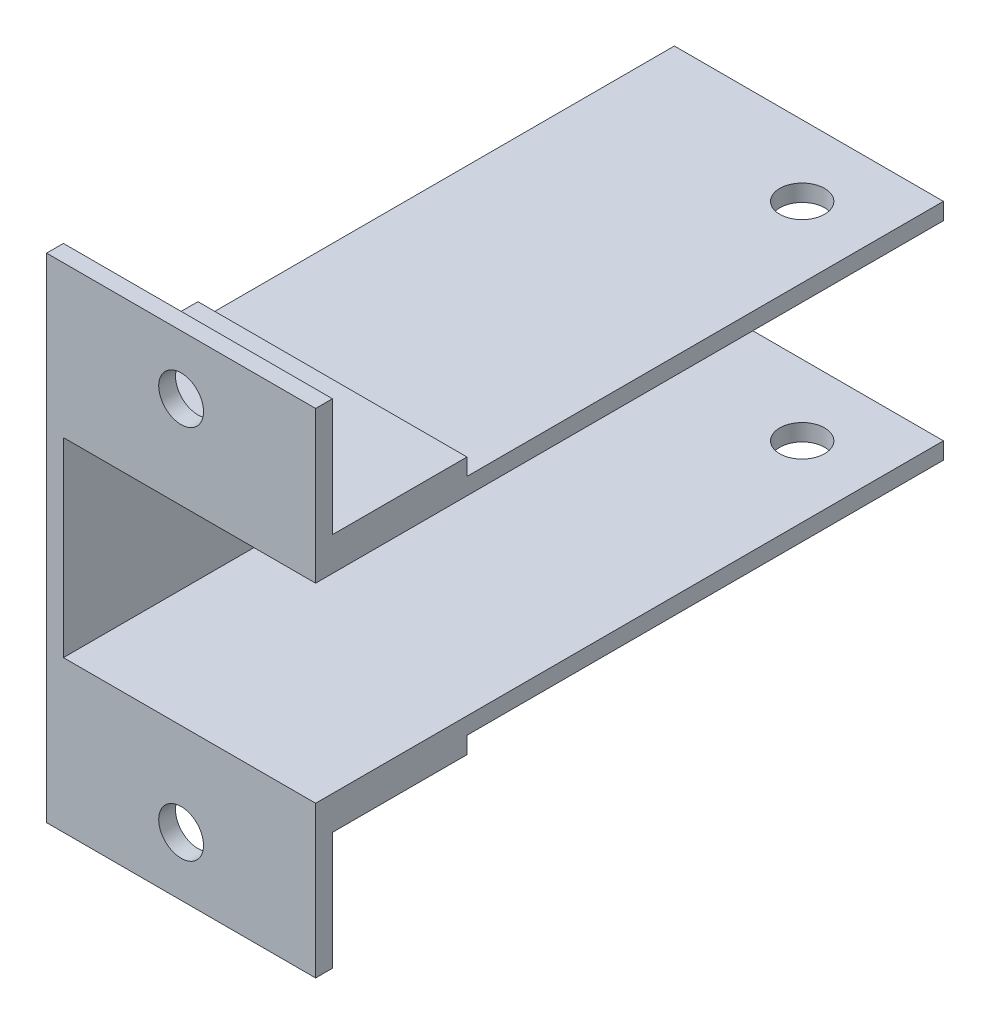
ISO-10303-21;
HEADER;
FILE_DESCRIPTION(('STEP AP214'),'2;1');
FILE_NAME('part.step','',(''),(''),'','','');
FILE_SCHEMA(('AUTOMOTIVE_DESIGN { 1 0 10303 214 1 1 1 1 }'));
ENDSEC;
DATA;
#1=APPLICATION_CONTEXT('core data for automotive mechanical design processes');
#2=APPLICATION_PROTOCOL_DEFINITION('international standard','automotive_design',2000,#1);
#3=PRODUCT_CONTEXT('',#1,'mechanical');
#4=PRODUCT('Part','Part','',(#3));
#5=PRODUCT_RELATED_PRODUCT_CATEGORY('part','',(#4));
#6=PRODUCT_DEFINITION_FORMATION('','',#4);
#7=PRODUCT_DEFINITION_CONTEXT('part definition',#1,'design');
#8=PRODUCT_DEFINITION('design','',#6,#7);
#9=PRODUCT_DEFINITION_SHAPE('','',#8);
#10=(LENGTH_UNIT() NAMED_UNIT(*) SI_UNIT(.MILLI.,.METRE.));
#11=(NAMED_UNIT(*) PLANE_ANGLE_UNIT() SI_UNIT($,.RADIAN.));
#12=(NAMED_UNIT(*) SI_UNIT($,.STERADIAN.) SOLID_ANGLE_UNIT());
#13=UNCERTAINTY_MEASURE_WITH_UNIT(LENGTH_MEASURE(1.E-05),#10,'distance_accuracy_value','');
#14=(GEOMETRIC_REPRESENTATION_CONTEXT(3) GLOBAL_UNCERTAINTY_ASSIGNED_CONTEXT((#13)) GLOBAL_UNIT_ASSIGNED_CONTEXT((#10,
#11,#12)) REPRESENTATION_CONTEXT('',''));
#15=CARTESIAN_POINT('',(0.,0.,0.));
#16=DIRECTION('',(0.,0.,1.));
#17=DIRECTION('',(1.,0.,0.));
#18=AXIS2_PLACEMENT_3D('',#15,#16,#17);
#19=CARTESIAN_POINT('',(0.,31.75,88.9));
#20=DIRECTION('',(0.,-1.,0.));
#21=DIRECTION('',(1.,0.,0.));
#22=AXIS2_PLACEMENT_3D('',#19,#20,#21);
#23=PLANE('',#22);
#24=CARTESIAN_POINT('',(56.2,31.75,-68.9));
#25=DIRECTION('',(0.,-1.,0.));
#26=DIRECTION('',(1.,0.,0.));
#27=AXIS2_PLACEMENT_3D('',#24,#25,#26);
#28=CIRCLE('',#27,6.35);
#29=CARTESIAN_POINT('',(62.55,31.75,-68.9));
#30=VERTEX_POINT('',#29);
#31=EDGE_CURVE('E282',#30,#30,#28,.T.);
#32=ORIENTED_EDGE('',*,*,#31,.T.);
#33=EDGE_LOOP('',(#32));
#34=FACE_BOUND('',#33,.T.);
#35=DIRECTION('',(-1.,0.,0.));
#36=VECTOR('',#35,1.);
#37=CARTESIAN_POINT('',(76.2,31.75,46.0375));
#38=LINE('',#37,#36);
#39=CARTESIAN_POINT('',(76.2,31.75,46.0375));
#40=VERTEX_POINT('',#39);
#41=CARTESIAN_POINT('',(0.,31.75,46.0375));
#42=VERTEX_POINT('',#41);
#43=EDGE_CURVE('E58',#40,#42,#38,.T.);
#44=ORIENTED_EDGE('',*,*,#43,.F.);
#45=DIRECTION('',(0.,0.,-1.));
#46=VECTOR('',#45,1.);
#47=CARTESIAN_POINT('',(76.2,31.75,88.9));
#48=LINE('',#47,#46);
#49=CARTESIAN_POINT('',(76.2,31.75,-88.9));
#50=VERTEX_POINT('',#49);
#51=EDGE_CURVE('E184',#40,#50,#48,.T.);
#52=ORIENTED_EDGE('',*,*,#51,.T.);
#53=DIRECTION('',(-1.,0.,0.));
#54=VECTOR('',#53,1.);
#55=CARTESIAN_POINT('',(0.,31.75,-88.9));
#56=LINE('',#55,#54);
#57=CARTESIAN_POINT('',(0.,31.75,-88.9));
#58=VERTEX_POINT('',#57);
#59=EDGE_CURVE('E203',#50,#58,#56,.T.);
#60=ORIENTED_EDGE('',*,*,#59,.T.);
#61=DIRECTION('',(0.,0.,-1.));
#62=VECTOR('',#61,1.);
#63=CARTESIAN_POINT('',(0.,31.75,88.9));
#64=LINE('',#63,#62);
#65=EDGE_CURVE('E11',#42,#58,#64,.T.);
#66=ORIENTED_EDGE('',*,*,#65,.F.);
#67=EDGE_LOOP('',(#44,#52,#60,#66));
#68=FACE_BOUND('',#67,.T.);
#69=ADVANCED_FACE('F35',(#34,#68),#23,.F.);
#70=CARTESIAN_POINT('',(0.,31.75,88.9));
#71=DIRECTION('',(1.,0.,0.));
#72=DIRECTION('',(0.,1.,0.));
#73=AXIS2_PLACEMENT_3D('',#70,#71,#72);
#74=PLANE('',#73);
#75=DIRECTION('',(0.,-1.,0.));
#76=VECTOR('',#75,1.);
#77=CARTESIAN_POINT('',(0.,31.75,-88.9));
#78=LINE('',#77,#76);
#79=CARTESIAN_POINT('',(0.,-31.75,-88.9));
#80=VERTEX_POINT('',#79);
#81=EDGE_CURVE('E200',#58,#80,#78,.T.);
#82=ORIENTED_EDGE('',*,*,#81,.T.);
#83=DIRECTION('',(0.,0.,-1.));
#84=VECTOR('',#83,1.);
#85=CARTESIAN_POINT('',(0.,-31.75,88.9));
#86=LINE('',#85,#84);
#87=CARTESIAN_POINT('',(0.,-31.75,46.0375));
#88=VERTEX_POINT('',#87);
#89=EDGE_CURVE('E43',#88,#80,#86,.T.);
#90=ORIENTED_EDGE('',*,*,#89,.F.);
#91=DIRECTION('',(0.,-1.,0.));
#92=VECTOR('',#91,1.);
#93=CARTESIAN_POINT('',(0.,0.,46.0375));
#94=LINE('',#93,#92);
#95=CARTESIAN_POINT('',(0.,-36.5125,46.0375));
#96=VERTEX_POINT('',#95);
#97=EDGE_CURVE('E50',#88,#96,#94,.T.);
#98=ORIENTED_EDGE('',*,*,#97,.T.);
#99=DIRECTION('',(0.,0.,1.));
#100=VECTOR('',#99,1.);
#101=CARTESIAN_POINT('',(0.,-36.5125,0.));
#102=LINE('',#101,#100);
#103=CARTESIAN_POINT('',(0.,-36.5125,84.1375));
#104=VERTEX_POINT('',#103);
#105=EDGE_CURVE('E163',#96,#104,#102,.T.);
#106=ORIENTED_EDGE('',*,*,#105,.T.);
#107=DIRECTION('',(0.,1.,0.));
#108=VECTOR('',#107,1.);
#109=CARTESIAN_POINT('',(0.,0.,84.1375));
#110=LINE('',#109,#108);
#111=CARTESIAN_POINT('',(0.,-69.85,84.1375));
#112=VERTEX_POINT('',#111);
#113=EDGE_CURVE('E266',#112,#104,#110,.T.);
#114=ORIENTED_EDGE('',*,*,#113,.F.);
#115=DIRECTION('',(0.,0.,-1.));
#116=VECTOR('',#115,1.);
#117=CARTESIAN_POINT('',(0.,-69.85,0.));
#118=LINE('',#117,#116);
#119=CARTESIAN_POINT('',(0.,-69.85,88.9));
#120=VERTEX_POINT('',#119);
#121=EDGE_CURVE('E269',#120,#112,#118,.T.);
#122=ORIENTED_EDGE('',*,*,#121,.F.);
#123=DIRECTION('',(0.,-1.,0.));
#124=VECTOR('',#123,1.);
#125=CARTESIAN_POINT('',(0.,31.75,88.9));
#126=LINE('',#125,#124);
#127=CARTESIAN_POINT('',(0.,69.85,88.9));
#128=VERTEX_POINT('',#127);
#129=EDGE_CURVE('E190',#128,#120,#126,.T.);
#130=ORIENTED_EDGE('',*,*,#129,.F.);
#131=DIRECTION('',(0.,0.,-1.));
#132=VECTOR('',#131,1.);
#133=CARTESIAN_POINT('',(0.,69.85,0.));
#134=LINE('',#133,#132);
#135=CARTESIAN_POINT('',(0.,69.85,84.1375));
#136=VERTEX_POINT('',#135);
#137=EDGE_CURVE('E228',#128,#136,#134,.T.);
#138=ORIENTED_EDGE('',*,*,#137,.T.);
#139=DIRECTION('',(0.,-1.,0.));
#140=VECTOR('',#139,1.);
#141=CARTESIAN_POINT('',(0.,0.,84.1375));
#142=LINE('',#141,#140);
#143=CARTESIAN_POINT('',(0.,36.5125,84.1375));
#144=VERTEX_POINT('',#143);
#145=EDGE_CURVE('E232',#136,#144,#142,.T.);
#146=ORIENTED_EDGE('',*,*,#145,.T.);
#147=DIRECTION('',(0.,0.,1.));
#148=VECTOR('',#147,1.);
#149=CARTESIAN_POINT('',(0.,36.5125,0.));
#150=LINE('',#149,#148);
#151=CARTESIAN_POINT('',(0.,36.5125,46.0375));
#152=VERTEX_POINT('',#151);
#153=EDGE_CURVE('E235',#152,#144,#150,.T.);
#154=ORIENTED_EDGE('',*,*,#153,.F.);
#155=DIRECTION('',(0.,1.,0.));
#156=VECTOR('',#155,1.);
#157=CARTESIAN_POINT('',(0.,0.,46.0375));
#158=LINE('',#157,#156);
#159=EDGE_CURVE('E238',#42,#152,#158,.T.);
#160=ORIENTED_EDGE('',*,*,#159,.F.);
#161=ORIENTED_EDGE('',*,*,#65,.T.);
#162=EDGE_LOOP('',(#82,#90,#98,#106,#114,#122,#130,#138,#146,#154,#160,#161));
#163=FACE_BOUND('',#162,.T.);
#164=ADVANCED_FACE('F307',(#163),#74,.F.);
#165=CARTESIAN_POINT('',(0.,-31.75,88.9));
#166=DIRECTION('',(0.,1.,0.));
#167=DIRECTION('',(0.,0.,1.));
#168=AXIS2_PLACEMENT_3D('',#165,#166,#167);
#169=PLANE('',#168);
#170=CARTESIAN_POINT('',(56.2,-31.75,-68.9));
#171=DIRECTION('',(0.,-1.,0.));
#172=DIRECTION('',(0.,0.,-1.));
#173=AXIS2_PLACEMENT_3D('',#170,#171,#172);
#174=CIRCLE('',#173,6.35);
#175=CARTESIAN_POINT('',(56.2,-31.75,-75.25));
#176=VERTEX_POINT('',#175);
#177=EDGE_CURVE('E288',#176,#176,#174,.T.);
#178=ORIENTED_EDGE('',*,*,#177,.F.);
#179=EDGE_LOOP('',(#178));
#180=FACE_BOUND('',#179,.T.);
#181=DIRECTION('',(0.,0.,-1.));
#182=VECTOR('',#181,1.);
#183=CARTESIAN_POINT('',(76.2,-31.75,88.9));
#184=LINE('',#183,#182);
#185=CARTESIAN_POINT('',(76.2,-31.75,46.0375));
#186=VERTEX_POINT('',#185);
#187=CARTESIAN_POINT('',(76.2,-31.75,-88.9));
#188=VERTEX_POINT('',#187);
#189=EDGE_CURVE('E158',#186,#188,#184,.T.);
#190=ORIENTED_EDGE('',*,*,#189,.F.);
#191=DIRECTION('',(-1.,0.,0.));
#192=VECTOR('',#191,1.);
#193=CARTESIAN_POINT('',(76.2,-31.75,46.0375));
#194=LINE('',#193,#192);
#195=EDGE_CURVE('E145',#186,#88,#194,.T.);
#196=ORIENTED_EDGE('',*,*,#195,.T.);
#197=ORIENTED_EDGE('',*,*,#89,.T.);
#198=DIRECTION('',(1.,0.,0.));
#199=VECTOR('',#198,1.);
#200=CARTESIAN_POINT('',(0.,-31.75,-88.9));
#201=LINE('',#200,#199);
#202=EDGE_CURVE('E167',#80,#188,#201,.T.);
#203=ORIENTED_EDGE('',*,*,#202,.T.);
#204=EDGE_LOOP('',(#190,#196,#197,#203));
#205=FACE_BOUND('',#204,.T.);
#206=ADVANCED_FACE('F165',(#180,#205),#169,.F.);
#207=CARTESIAN_POINT('',(76.2,-31.75,88.9));
#208=DIRECTION('',(-1.,0.,0.));
#209=DIRECTION('',(0.,0.,1.));
#210=AXIS2_PLACEMENT_3D('',#207,#208,#209);
#211=PLANE('',#210);
#212=DIRECTION('',(0.,1.,0.));
#213=VECTOR('',#212,1.);
#214=CARTESIAN_POINT('',(76.2,-31.75,-88.9));
#215=LINE('',#214,#213);
#216=CARTESIAN_POINT('',(76.2,-26.9875,-88.9));
#217=VERTEX_POINT('',#216);
#218=EDGE_CURVE('E197',#188,#217,#215,.T.);
#219=ORIENTED_EDGE('',*,*,#218,.T.);
#220=DIRECTION('',(0.,0.,-1.));
#221=VECTOR('',#220,1.);
#222=CARTESIAN_POINT('',(76.2,-26.9875,88.9));
#223=LINE('',#222,#221);
#224=CARTESIAN_POINT('',(76.2,-26.9875,88.9));
#225=VERTEX_POINT('',#224);
#226=EDGE_CURVE('E169',#225,#217,#223,.T.);
#227=ORIENTED_EDGE('',*,*,#226,.F.);
#228=DIRECTION('',(0.,1.,0.));
#229=VECTOR('',#228,1.);
#230=CARTESIAN_POINT('',(76.2,-31.75,88.9));
#231=LINE('',#230,#229);
#232=CARTESIAN_POINT('',(76.2,-69.85,88.9));
#233=VERTEX_POINT('',#232);
#234=EDGE_CURVE('E214',#233,#225,#231,.T.);
#235=ORIENTED_EDGE('',*,*,#234,.F.);
#236=DIRECTION('',(0.,0.,-1.));
#237=VECTOR('',#236,1.);
#238=CARTESIAN_POINT('',(76.2,-69.85,0.));
#239=LINE('',#238,#237);
#240=CARTESIAN_POINT('',(76.2,-69.85,84.1375));
#241=VERTEX_POINT('',#240);
#242=EDGE_CURVE('E162',#233,#241,#239,.T.);
#243=ORIENTED_EDGE('',*,*,#242,.T.);
#244=DIRECTION('',(0.,1.,0.));
#245=VECTOR('',#244,1.);
#246=CARTESIAN_POINT('',(76.2,0.,84.1375));
#247=LINE('',#246,#245);
#248=CARTESIAN_POINT('',(76.2,-36.5125,84.1375));
#249=VERTEX_POINT('',#248);
#250=EDGE_CURVE('E274',#241,#249,#247,.T.);
#251=ORIENTED_EDGE('',*,*,#250,.T.);
#252=DIRECTION('',(0.,0.,1.));
#253=VECTOR('',#252,1.);
#254=CARTESIAN_POINT('',(76.2,-36.5125,0.));
#255=LINE('',#254,#253);
#256=CARTESIAN_POINT('',(76.2,-36.5125,46.0375));
#257=VERTEX_POINT('',#256);
#258=EDGE_CURVE('E161',#257,#249,#255,.T.);
#259=ORIENTED_EDGE('',*,*,#258,.F.);
#260=DIRECTION('',(0.,-1.,0.));
#261=VECTOR('',#260,1.);
#262=CARTESIAN_POINT('',(76.2,0.,46.0375));
#263=LINE('',#262,#261);
#264=EDGE_CURVE('E148',#186,#257,#263,.T.);
#265=ORIENTED_EDGE('',*,*,#264,.F.);
#266=ORIENTED_EDGE('',*,*,#189,.T.);
#267=EDGE_LOOP('',(#219,#227,#235,#243,#251,#259,#265,#266));
#268=FACE_BOUND('',#267,.T.);
#269=ADVANCED_FACE('F157',(#268),#211,.F.);
#270=CARTESIAN_POINT('',(4.7625,-26.9875,88.9));
#271=DIRECTION('',(0.,-1.,0.));
#272=DIRECTION('',(1.,0.,0.));
#273=AXIS2_PLACEMENT_3D('',#270,#271,#272);
#274=PLANE('',#273);
#275=CARTESIAN_POINT('',(56.2,-26.9875,-68.9));
#276=DIRECTION('',(0.,-1.,0.));
#277=DIRECTION('',(1.,0.,0.));
#278=AXIS2_PLACEMENT_3D('',#275,#276,#277);
#279=CIRCLE('',#278,6.35);
#280=CARTESIAN_POINT('',(62.55,-26.9875,-68.9));
#281=VERTEX_POINT('',#280);
#282=EDGE_CURVE('E285',#281,#281,#279,.T.);
#283=ORIENTED_EDGE('',*,*,#282,.T.);
#284=EDGE_LOOP('',(#283));
#285=FACE_BOUND('',#284,.T.);
#286=DIRECTION('',(-1.,0.,0.));
#287=VECTOR('',#286,1.);
#288=CARTESIAN_POINT('',(4.7625,-26.9875,-88.9));
#289=LINE('',#288,#287);
#290=CARTESIAN_POINT('',(4.7625,-26.9875,-88.9));
#291=VERTEX_POINT('',#290);
#292=EDGE_CURVE('E195',#217,#291,#289,.T.);
#293=ORIENTED_EDGE('',*,*,#292,.T.);
#294=DIRECTION('',(0.,0.,-1.));
#295=VECTOR('',#294,1.);
#296=CARTESIAN_POINT('',(4.7625,-26.9875,88.9));
#297=LINE('',#296,#295);
#298=CARTESIAN_POINT('',(4.7625,-26.9875,88.9));
#299=VERTEX_POINT('',#298);
#300=EDGE_CURVE('E173',#299,#291,#297,.T.);
#301=ORIENTED_EDGE('',*,*,#300,.F.);
#302=DIRECTION('',(-1.,0.,0.));
#303=VECTOR('',#302,1.);
#304=CARTESIAN_POINT('',(4.7625,-26.9875,88.9));
#305=LINE('',#304,#303);
#306=EDGE_CURVE('E212',#225,#299,#305,.T.);
#307=ORIENTED_EDGE('',*,*,#306,.F.);
#308=ORIENTED_EDGE('',*,*,#226,.T.);
#309=EDGE_LOOP('',(#293,#301,#307,#308));
#310=FACE_BOUND('',#309,.T.);
#311=ADVANCED_FACE('F320',(#285,#310),#274,.F.);
#312=CARTESIAN_POINT('',(4.7625,26.9875,88.9));
#313=DIRECTION('',(-1.,0.,0.));
#314=DIRECTION('',(0.,0.,1.));
#315=AXIS2_PLACEMENT_3D('',#312,#313,#314);
#316=PLANE('',#315);
#317=DIRECTION('',(0.,1.,0.));
#318=VECTOR('',#317,1.);
#319=CARTESIAN_POINT('',(4.7625,26.9875,-88.9));
#320=LINE('',#319,#318);
#321=CARTESIAN_POINT('',(4.7625,26.9875,-88.9));
#322=VERTEX_POINT('',#321);
#323=EDGE_CURVE('E193',#291,#322,#320,.T.);
#324=ORIENTED_EDGE('',*,*,#323,.T.);
#325=DIRECTION('',(0.,0.,-1.));
#326=VECTOR('',#325,1.);
#327=CARTESIAN_POINT('',(4.7625,26.9875,88.9));
#328=LINE('',#327,#326);
#329=CARTESIAN_POINT('',(4.7625,26.9875,88.9));
#330=VERTEX_POINT('',#329);
#331=EDGE_CURVE('E178',#330,#322,#328,.T.);
#332=ORIENTED_EDGE('',*,*,#331,.F.);
#333=DIRECTION('',(0.,1.,0.));
#334=VECTOR('',#333,1.);
#335=CARTESIAN_POINT('',(4.7625,26.9875,88.9));
#336=LINE('',#335,#334);
#337=EDGE_CURVE('E210',#299,#330,#336,.T.);
#338=ORIENTED_EDGE('',*,*,#337,.F.);
#339=ORIENTED_EDGE('',*,*,#300,.T.);
#340=EDGE_LOOP('',(#324,#332,#338,#339));
#341=FACE_BOUND('',#340,.T.);
#342=ADVANCED_FACE('F323',(#341),#316,.F.);
#343=CARTESIAN_POINT('',(4.7625,26.9875,88.9));
#344=DIRECTION('',(0.,1.,0.));
#345=DIRECTION('',(0.,0.,1.));
#346=AXIS2_PLACEMENT_3D('',#343,#344,#345);
#347=PLANE('',#346);
#348=CARTESIAN_POINT('',(56.2,26.9875,-68.9));
#349=DIRECTION('',(0.,1.,0.));
#350=DIRECTION('',(0.,0.,1.));
#351=AXIS2_PLACEMENT_3D('',#348,#349,#350);
#352=CIRCLE('',#351,6.35);
#353=CARTESIAN_POINT('',(56.2,26.9875,-62.55));
#354=VERTEX_POINT('',#353);
#355=EDGE_CURVE('E38',#354,#354,#352,.T.);
#356=ORIENTED_EDGE('',*,*,#355,.T.);
#357=EDGE_LOOP('',(#356));
#358=FACE_BOUND('',#357,.T.);
#359=DIRECTION('',(1.,0.,0.));
#360=VECTOR('',#359,1.);
#361=CARTESIAN_POINT('',(4.7625,26.9875,-88.9));
#362=LINE('',#361,#360);
#363=CARTESIAN_POINT('',(76.2,26.9875,-88.9));
#364=VERTEX_POINT('',#363);
#365=EDGE_CURVE('E191',#322,#364,#362,.T.);
#366=ORIENTED_EDGE('',*,*,#365,.T.);
#367=DIRECTION('',(0.,0.,-1.));
#368=VECTOR('',#367,1.);
#369=CARTESIAN_POINT('',(76.2,26.9875,88.9));
#370=LINE('',#369,#368);
#371=CARTESIAN_POINT('',(76.2,26.9875,88.9));
#372=VERTEX_POINT('',#371);
#373=EDGE_CURVE('E181',#372,#364,#370,.T.);
#374=ORIENTED_EDGE('',*,*,#373,.F.);
#375=DIRECTION('',(1.,0.,0.));
#376=VECTOR('',#375,1.);
#377=CARTESIAN_POINT('',(4.7625,26.9875,88.9));
#378=LINE('',#377,#376);
#379=EDGE_CURVE('E208',#330,#372,#378,.T.);
#380=ORIENTED_EDGE('',*,*,#379,.F.);
#381=ORIENTED_EDGE('',*,*,#331,.T.);
#382=EDGE_LOOP('',(#366,#374,#380,#381));
#383=FACE_BOUND('',#382,.T.);
#384=ADVANCED_FACE('F295',(#358,#383),#347,.F.);
#385=CARTESIAN_POINT('',(76.2,31.75,88.9));
#386=DIRECTION('',(-1.,0.,0.));
#387=DIRECTION('',(0.,0.,1.));
#388=AXIS2_PLACEMENT_3D('',#385,#386,#387);
#389=PLANE('',#388);
#390=DIRECTION('',(0.,1.,0.));
#391=VECTOR('',#390,1.);
#392=CARTESIAN_POINT('',(76.2,31.75,-88.9));
#393=LINE('',#392,#391);
#394=EDGE_CURVE('E187',#364,#50,#393,.T.);
#395=ORIENTED_EDGE('',*,*,#394,.T.);
#396=ORIENTED_EDGE('',*,*,#51,.F.);
#397=DIRECTION('',(0.,1.,0.));
#398=VECTOR('',#397,1.);
#399=CARTESIAN_POINT('',(76.2,0.,46.0375));
#400=LINE('',#399,#398);
#401=CARTESIAN_POINT('',(76.2,36.5125,46.0375));
#402=VERTEX_POINT('',#401);
#403=EDGE_CURVE('E231',#40,#402,#400,.T.);
#404=ORIENTED_EDGE('',*,*,#403,.T.);
#405=DIRECTION('',(0.,0.,1.));
#406=VECTOR('',#405,1.);
#407=CARTESIAN_POINT('',(76.2,36.5125,0.));
#408=LINE('',#407,#406);
#409=CARTESIAN_POINT('',(76.2,36.5125,84.1375));
#410=VERTEX_POINT('',#409);
#411=EDGE_CURVE('E247',#402,#410,#408,.T.);
#412=ORIENTED_EDGE('',*,*,#411,.T.);
#413=DIRECTION('',(0.,-1.,0.));
#414=VECTOR('',#413,1.);
#415=CARTESIAN_POINT('',(76.2,0.,84.1375));
#416=LINE('',#415,#414);
#417=CARTESIAN_POINT('',(76.2,69.85,84.1375));
#418=VERTEX_POINT('',#417);
#419=EDGE_CURVE('E244',#418,#410,#416,.T.);
#420=ORIENTED_EDGE('',*,*,#419,.F.);
#421=DIRECTION('',(0.,0.,-1.));
#422=VECTOR('',#421,1.);
#423=CARTESIAN_POINT('',(76.2,69.85,0.));
#424=LINE('',#423,#422);
#425=CARTESIAN_POINT('',(76.2,69.85,88.9));
#426=VERTEX_POINT('',#425);
#427=EDGE_CURVE('E227',#426,#418,#424,.T.);
#428=ORIENTED_EDGE('',*,*,#427,.F.);
#429=DIRECTION('',(0.,1.,0.));
#430=VECTOR('',#429,1.);
#431=CARTESIAN_POINT('',(76.2,31.75,88.9));
#432=LINE('',#431,#430);
#433=EDGE_CURVE('E186',#372,#426,#432,.T.);
#434=ORIENTED_EDGE('',*,*,#433,.F.);
#435=ORIENTED_EDGE('',*,*,#373,.T.);
#436=EDGE_LOOP('',(#395,#396,#404,#412,#420,#428,#434,#435));
#437=FACE_BOUND('',#436,.T.);
#438=ADVANCED_FACE('F330',(#437),#389,.F.);
#439=CARTESIAN_POINT('',(0.,0.,88.9));
#440=DIRECTION('',(0.,0.,-1.));
#441=DIRECTION('',(-1.,0.,0.));
#442=AXIS2_PLACEMENT_3D('',#439,#440,#441);
#443=PLANE('',#442);
#444=CARTESIAN_POINT('',(38.1,-53.18125,88.9));
#445=DIRECTION('',(0.,0.,-1.));
#446=DIRECTION('',(-1.,0.,0.));
#447=AXIS2_PLACEMENT_3D('',#444,#445,#446);
#448=CIRCLE('',#447,6.35);
#449=CARTESIAN_POINT('',(31.75,-53.18125,88.9));
#450=VERTEX_POINT('',#449);
#451=EDGE_CURVE('E272',#450,#450,#448,.F.);
#452=ORIENTED_EDGE('',*,*,#451,.F.);
#453=EDGE_LOOP('',(#452));
#454=FACE_BOUND('',#453,.T.);
#455=CARTESIAN_POINT('',(38.1,53.18125,88.9));
#456=DIRECTION('',(0.,0.,-1.));
#457=DIRECTION('',(-1.,0.,0.));
#458=AXIS2_PLACEMENT_3D('',#455,#456,#457);
#459=CIRCLE('',#458,6.35);
#460=CARTESIAN_POINT('',(31.75,53.18125,88.9));
#461=VERTEX_POINT('',#460);
#462=EDGE_CURVE('E241',#461,#461,#459,.T.);
#463=ORIENTED_EDGE('',*,*,#462,.T.);
#464=EDGE_LOOP('',(#463));
#465=FACE_BOUND('',#464,.T.);
#466=ORIENTED_EDGE('',*,*,#433,.T.);
#467=DIRECTION('',(-1.,0.,0.));
#468=VECTOR('',#467,1.);
#469=CARTESIAN_POINT('',(76.2,69.85,88.9));
#470=LINE('',#469,#468);
#471=EDGE_CURVE('E223',#426,#128,#470,.T.);
#472=ORIENTED_EDGE('',*,*,#471,.T.);
#473=ORIENTED_EDGE('',*,*,#129,.T.);
#474=DIRECTION('',(-1.,0.,0.));
#475=VECTOR('',#474,1.);
#476=CARTESIAN_POINT('',(76.2,-69.85,88.9));
#477=LINE('',#476,#475);
#478=EDGE_CURVE('E154',#233,#120,#477,.T.);
#479=ORIENTED_EDGE('',*,*,#478,.F.);
#480=ORIENTED_EDGE('',*,*,#234,.T.);
#481=ORIENTED_EDGE('',*,*,#306,.T.);
#482=ORIENTED_EDGE('',*,*,#337,.T.);
#483=ORIENTED_EDGE('',*,*,#379,.T.);
#484=EDGE_LOOP('',(#466,#472,#473,#479,#480,#481,#482,#483));
#485=FACE_BOUND('',#484,.T.);
#486=ADVANCED_FACE('F333',(#454,#465,#485),#443,.F.);
#487=CARTESIAN_POINT('',(0.,0.,-88.9));
#488=DIRECTION('',(0.,0.,-1.));
#489=DIRECTION('',(-1.,0.,0.));
#490=AXIS2_PLACEMENT_3D('',#487,#488,#489);
#491=PLANE('',#490);
#492=ORIENTED_EDGE('',*,*,#59,.F.);
#493=ORIENTED_EDGE('',*,*,#394,.F.);
#494=ORIENTED_EDGE('',*,*,#365,.F.);
#495=ORIENTED_EDGE('',*,*,#323,.F.);
#496=ORIENTED_EDGE('',*,*,#292,.F.);
#497=ORIENTED_EDGE('',*,*,#218,.F.);
#498=ORIENTED_EDGE('',*,*,#202,.F.);
#499=ORIENTED_EDGE('',*,*,#81,.F.);
#500=EDGE_LOOP('',(#492,#493,#494,#495,#496,#497,#498,#499));
#501=FACE_BOUND('',#500,.T.);
#502=ADVANCED_FACE('F335',(#501),#491,.T.);
#503=CARTESIAN_POINT('',(76.2,0.,46.0375));
#504=DIRECTION('',(0.,0.,1.));
#505=DIRECTION('',(1.,0.,0.));
#506=AXIS2_PLACEMENT_3D('',#503,#504,#505);
#507=PLANE('',#506);
#508=ORIENTED_EDGE('',*,*,#159,.T.);
#509=DIRECTION('',(-1.,0.,0.));
#510=VECTOR('',#509,1.);
#511=CARTESIAN_POINT('',(76.2,36.5125,46.0375));
#512=LINE('',#511,#510);
#513=EDGE_CURVE('E206',#402,#152,#512,.T.);
#514=ORIENTED_EDGE('',*,*,#513,.F.);
#515=ORIENTED_EDGE('',*,*,#403,.F.);
#516=ORIENTED_EDGE('',*,*,#43,.T.);
#517=EDGE_LOOP('',(#508,#514,#515,#516));
#518=FACE_BOUND('',#517,.T.);
#519=ADVANCED_FACE('F338',(#518),#507,.F.);
#520=CARTESIAN_POINT('',(76.2,36.5125,0.));
#521=DIRECTION('',(0.,-1.,0.));
#522=DIRECTION('',(0.,0.,-1.));
#523=AXIS2_PLACEMENT_3D('',#520,#521,#522);
#524=PLANE('',#523);
#525=ORIENTED_EDGE('',*,*,#153,.T.);
#526=DIRECTION('',(-1.,0.,0.));
#527=VECTOR('',#526,1.);
#528=CARTESIAN_POINT('',(76.2,36.5125,84.1375));
#529=LINE('',#528,#527);
#530=EDGE_CURVE('E219',#410,#144,#529,.T.);
#531=ORIENTED_EDGE('',*,*,#530,.F.);
#532=ORIENTED_EDGE('',*,*,#411,.F.);
#533=ORIENTED_EDGE('',*,*,#513,.T.);
#534=EDGE_LOOP('',(#525,#531,#532,#533));
#535=FACE_BOUND('',#534,.T.);
#536=ADVANCED_FACE('F345',(#535),#524,.F.);
#537=CARTESIAN_POINT('',(76.2,0.,84.1375));
#538=DIRECTION('',(0.,0.,-1.));
#539=DIRECTION('',(0.,1.,0.));
#540=AXIS2_PLACEMENT_3D('',#537,#538,#539);
#541=PLANE('',#540);
#542=CARTESIAN_POINT('',(38.1,53.18125,84.1375));
#543=DIRECTION('',(0.,0.,-1.));
#544=DIRECTION('',(0.,1.,0.));
#545=AXIS2_PLACEMENT_3D('',#542,#543,#544);
#546=CIRCLE('',#545,6.35);
#547=CARTESIAN_POINT('',(38.1,59.53125,84.1375));
#548=VERTEX_POINT('',#547);
#549=EDGE_CURVE('E153',#548,#548,#546,.T.);
#550=ORIENTED_EDGE('',*,*,#549,.F.);
#551=EDGE_LOOP('',(#550));
#552=FACE_BOUND('',#551,.T.);
#553=ORIENTED_EDGE('',*,*,#145,.F.);
#554=DIRECTION('',(-1.,0.,0.));
#555=VECTOR('',#554,1.);
#556=CARTESIAN_POINT('',(76.2,69.85,84.1375));
#557=LINE('',#556,#555);
#558=EDGE_CURVE('E221',#418,#136,#557,.T.);
#559=ORIENTED_EDGE('',*,*,#558,.F.);
#560=ORIENTED_EDGE('',*,*,#419,.T.);
#561=ORIENTED_EDGE('',*,*,#530,.T.);
#562=EDGE_LOOP('',(#553,#559,#560,#561));
#563=FACE_BOUND('',#562,.T.);
#564=ADVANCED_FACE('F349',(#552,#563),#541,.T.);
#565=CARTESIAN_POINT('',(76.2,69.85,0.));
#566=DIRECTION('',(0.,1.,0.));
#567=DIRECTION('',(0.,0.,1.));
#568=AXIS2_PLACEMENT_3D('',#565,#566,#567);
#569=PLANE('',#568);
#570=ORIENTED_EDGE('',*,*,#137,.F.);
#571=ORIENTED_EDGE('',*,*,#471,.F.);
#572=ORIENTED_EDGE('',*,*,#427,.T.);
#573=ORIENTED_EDGE('',*,*,#558,.T.);
#574=EDGE_LOOP('',(#570,#571,#572,#573));
#575=FACE_BOUND('',#574,.T.);
#576=ADVANCED_FACE('F353',(#575),#569,.T.);
#577=CARTESIAN_POINT('',(38.1,53.18125,161.9375));
#578=DIRECTION('',(0.,0.,-1.));
#579=DIRECTION('',(0.,1.,0.));
#580=AXIS2_PLACEMENT_3D('',#577,#578,#579);
#581=CYLINDRICAL_SURFACE('',#580,6.35);
#582=ORIENTED_EDGE('',*,*,#549,.T.);
#583=EDGE_LOOP('',(#582));
#584=FACE_BOUND('',#583,.T.);
#585=ORIENTED_EDGE('',*,*,#462,.F.);
#586=EDGE_LOOP('',(#585));
#587=FACE_BOUND('',#586,.T.);
#588=ADVANCED_FACE('F357',(#584,#587),#581,.F.);
#589=CARTESIAN_POINT('',(76.2,0.,46.0375));
#590=DIRECTION('',(0.,0.,-1.));
#591=DIRECTION('',(-1.,0.,0.));
#592=AXIS2_PLACEMENT_3D('',#589,#590,#591);
#593=PLANE('',#592);
#594=ORIENTED_EDGE('',*,*,#97,.F.);
#595=ORIENTED_EDGE('',*,*,#195,.F.);
#596=ORIENTED_EDGE('',*,*,#264,.T.);
#597=DIRECTION('',(-1.,0.,0.));
#598=VECTOR('',#597,1.);
#599=CARTESIAN_POINT('',(76.2,-36.5125,46.0375));
#600=LINE('',#599,#598);
#601=EDGE_CURVE('E262',#257,#96,#600,.T.);
#602=ORIENTED_EDGE('',*,*,#601,.T.);
#603=EDGE_LOOP('',(#594,#595,#596,#602));
#604=FACE_BOUND('',#603,.T.);
#605=ADVANCED_FACE('F147',(#604),#593,.T.);
#606=CARTESIAN_POINT('',(76.2,-69.85,0.));
#607=DIRECTION('',(0.,1.,0.));
#608=DIRECTION('',(0.,0.,1.));
#609=AXIS2_PLACEMENT_3D('',#606,#607,#608);
#610=PLANE('',#609);
#611=ORIENTED_EDGE('',*,*,#121,.T.);
#612=DIRECTION('',(-1.,0.,0.));
#613=VECTOR('',#612,1.);
#614=CARTESIAN_POINT('',(76.2,-69.85,84.1375));
#615=LINE('',#614,#613);
#616=EDGE_CURVE('E257',#241,#112,#615,.T.);
#617=ORIENTED_EDGE('',*,*,#616,.F.);
#618=ORIENTED_EDGE('',*,*,#242,.F.);
#619=ORIENTED_EDGE('',*,*,#478,.T.);
#620=EDGE_LOOP('',(#611,#617,#618,#619));
#621=FACE_BOUND('',#620,.T.);
#622=ADVANCED_FACE('F364',(#621),#610,.F.);
#623=CARTESIAN_POINT('',(76.2,0.,84.1375));
#624=DIRECTION('',(0.,0.,1.));
#625=DIRECTION('',(0.,-1.,0.));
#626=AXIS2_PLACEMENT_3D('',#623,#624,#625);
#627=PLANE('',#626);
#628=CARTESIAN_POINT('',(38.1,-53.18125,84.1375));
#629=DIRECTION('',(0.,0.,1.));
#630=DIRECTION('',(0.,-1.,0.));
#631=AXIS2_PLACEMENT_3D('',#628,#629,#630);
#632=CIRCLE('',#631,6.35);
#633=CARTESIAN_POINT('',(38.1,-59.53125,84.1375));
#634=VERTEX_POINT('',#633);
#635=EDGE_CURVE('E279',#634,#634,#632,.T.);
#636=ORIENTED_EDGE('',*,*,#635,.T.);
#637=EDGE_LOOP('',(#636));
#638=FACE_BOUND('',#637,.T.);
#639=ORIENTED_EDGE('',*,*,#113,.T.);
#640=DIRECTION('',(-1.,0.,0.));
#641=VECTOR('',#640,1.);
#642=CARTESIAN_POINT('',(76.2,-36.5125,84.1375));
#643=LINE('',#642,#641);
#644=EDGE_CURVE('E260',#249,#104,#643,.T.);
#645=ORIENTED_EDGE('',*,*,#644,.F.);
#646=ORIENTED_EDGE('',*,*,#250,.F.);
#647=ORIENTED_EDGE('',*,*,#616,.T.);
#648=EDGE_LOOP('',(#639,#645,#646,#647));
#649=FACE_BOUND('',#648,.T.);
#650=ADVANCED_FACE('F367',(#638,#649),#627,.F.);
#651=CARTESIAN_POINT('',(76.2,-36.5125,0.));
#652=DIRECTION('',(0.,-1.,0.));
#653=DIRECTION('',(0.,0.,-1.));
#654=AXIS2_PLACEMENT_3D('',#651,#652,#653);
#655=PLANE('',#654);
#656=ORIENTED_EDGE('',*,*,#105,.F.);
#657=ORIENTED_EDGE('',*,*,#601,.F.);
#658=ORIENTED_EDGE('',*,*,#258,.T.);
#659=ORIENTED_EDGE('',*,*,#644,.T.);
#660=EDGE_LOOP('',(#656,#657,#658,#659));
#661=FACE_BOUND('',#660,.T.);
#662=ADVANCED_FACE('F371',(#661),#655,.T.);
#663=CARTESIAN_POINT('',(38.1,-53.18125,161.9375));
#664=DIRECTION('',(0.,0.,-1.));
#665=DIRECTION('',(0.,1.,0.));
#666=AXIS2_PLACEMENT_3D('',#663,#664,#665);
#667=CYLINDRICAL_SURFACE('',#666,6.35);
#668=ORIENTED_EDGE('',*,*,#635,.F.);
#669=EDGE_LOOP('',(#668));
#670=FACE_BOUND('',#669,.T.);
#671=ORIENTED_EDGE('',*,*,#451,.T.);
#672=EDGE_LOOP('',(#671));
#673=FACE_BOUND('',#672,.T.);
#674=ADVANCED_FACE('F302',(#670,#673),#667,.F.);
#675=CARTESIAN_POINT('',(56.2,46.05,-68.9));
#676=DIRECTION('',(0.,-1.,0.));
#677=DIRECTION('',(0.,0.,-1.));
#678=AXIS2_PLACEMENT_3D('',#675,#676,#677);
#679=CYLINDRICAL_SURFACE('',#678,6.35);
#680=ORIENTED_EDGE('',*,*,#355,.F.);
#681=EDGE_LOOP('',(#680));
#682=FACE_BOUND('',#681,.T.);
#683=ORIENTED_EDGE('',*,*,#31,.F.);
#684=EDGE_LOOP('',(#683));
#685=FACE_BOUND('',#684,.T.);
#686=ADVANCED_FACE('F298',(#682,#685),#679,.F.);
#687=ORIENTED_EDGE('',*,*,#177,.T.);
#688=EDGE_LOOP('',(#687));
#689=FACE_BOUND('',#688,.T.);
#690=ORIENTED_EDGE('',*,*,#282,.F.);
#691=EDGE_LOOP('',(#690));
#692=FACE_BOUND('',#691,.T.);
#693=ADVANCED_FACE('F301',(#689,#692),#679,.F.);
#694=CLOSED_SHELL('',(#69,#164,#206,#269,#311,#342,#384,#438,#486,#502,#519,#536,#564,#576,#588,
#605,#622,#650,#662,#674,#686,#693));
#695=MANIFOLD_SOLID_BREP('B2',#694);
#696=ADVANCED_BREP_SHAPE_REPRESENTATION('',(#18,#695),#14);
#697=SHAPE_DEFINITION_REPRESENTATION(#9,#696);
ENDSEC;
END-ISO-10303-21;
